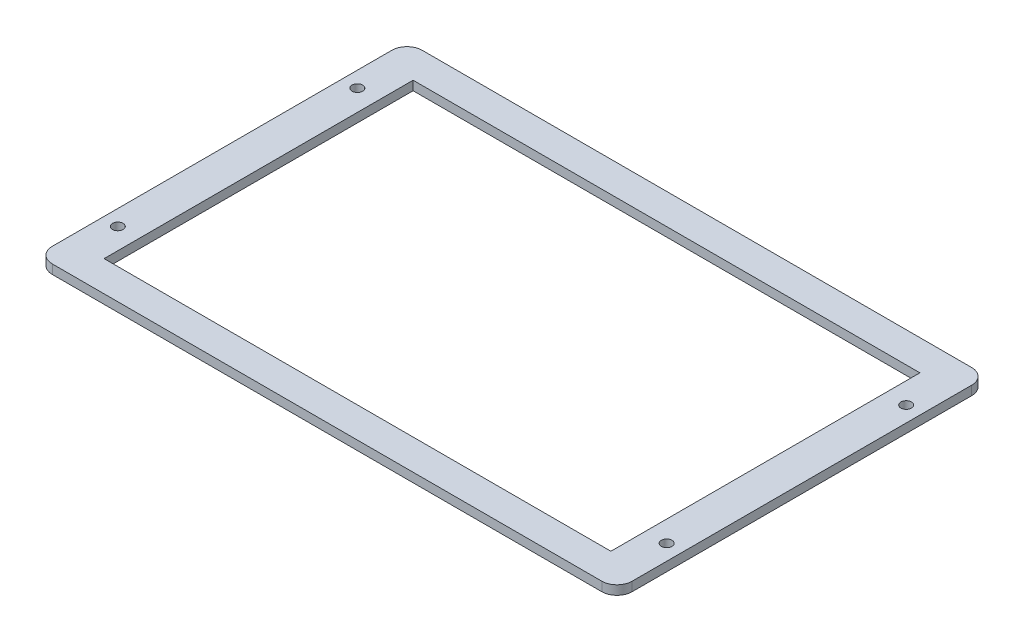
ISO-10303-21;
HEADER;
FILE_DESCRIPTION(('STEP AP214'),'2;1');
FILE_NAME('part.step','',(''),(''),'','','');
FILE_SCHEMA(('AUTOMOTIVE_DESIGN { 1 0 10303 214 1 1 1 1 }'));
ENDSEC;
DATA;
#1=APPLICATION_CONTEXT('core data for automotive mechanical design processes');
#2=APPLICATION_PROTOCOL_DEFINITION('international standard','automotive_design',2000,#1);
#3=PRODUCT_CONTEXT('',#1,'mechanical');
#4=PRODUCT('Part','Part','',(#3));
#5=PRODUCT_RELATED_PRODUCT_CATEGORY('part','',(#4));
#6=PRODUCT_DEFINITION_FORMATION('','',#4);
#7=PRODUCT_DEFINITION_CONTEXT('part definition',#1,'design');
#8=PRODUCT_DEFINITION('design','',#6,#7);
#9=PRODUCT_DEFINITION_SHAPE('','',#8);
#10=(LENGTH_UNIT() NAMED_UNIT(*) SI_UNIT(.MILLI.,.METRE.));
#11=(NAMED_UNIT(*) PLANE_ANGLE_UNIT() SI_UNIT($,.RADIAN.));
#12=(NAMED_UNIT(*) SI_UNIT($,.STERADIAN.) SOLID_ANGLE_UNIT());
#13=UNCERTAINTY_MEASURE_WITH_UNIT(LENGTH_MEASURE(1.E-05),#10,'distance_accuracy_value','');
#14=(GEOMETRIC_REPRESENTATION_CONTEXT(3) GLOBAL_UNCERTAINTY_ASSIGNED_CONTEXT((#13)) GLOBAL_UNIT_ASSIGNED_CONTEXT((#10,
#11,#12)) REPRESENTATION_CONTEXT('',''));
#15=CARTESIAN_POINT('',(0.,0.,0.));
#16=DIRECTION('',(0.,0.,1.));
#17=DIRECTION('',(1.,0.,0.));
#18=AXIS2_PLACEMENT_3D('',#15,#16,#17);
#19=CARTESIAN_POINT('',(0.,3.,0.));
#20=DIRECTION('',(0.,1.,0.));
#21=DIRECTION('',(0.,0.,1.));
#22=AXIS2_PLACEMENT_3D('',#19,#20,#21);
#23=PLANE('',#22);
#24=CARTESIAN_POINT('',(-90.05,3.,-39.2999999999998));
#25=DIRECTION('',(0.,1.,0.));
#26=DIRECTION('',(0.,0.,1.));
#27=AXIS2_PLACEMENT_3D('',#24,#25,#26);
#28=CIRCLE('',#27,1.75);
#29=CARTESIAN_POINT('',(-90.05,3.,-37.5499999999998));
#30=VERTEX_POINT('',#29);
#31=EDGE_CURVE('E457',#30,#30,#28,.T.);
#32=ORIENTED_EDGE('',*,*,#31,.F.);
#33=EDGE_LOOP('',(#32));
#34=FACE_BOUND('',#33,.T.);
#35=CARTESIAN_POINT('',(90.05,3.,39.3000000000002));
#36=DIRECTION('',(0.,1.,0.));
#37=DIRECTION('',(0.,0.,1.));
#38=AXIS2_PLACEMENT_3D('',#35,#36,#37);
#39=CIRCLE('',#38,1.75000000000001);
#40=CARTESIAN_POINT('',(90.05,3.,41.0500000000002));
#41=VERTEX_POINT('',#40);
#42=EDGE_CURVE('E452',#41,#41,#39,.T.);
#43=ORIENTED_EDGE('',*,*,#42,.F.);
#44=EDGE_LOOP('',(#43));
#45=FACE_BOUND('',#44,.T.);
#46=CARTESIAN_POINT('',(-90.05,3.,39.3));
#47=DIRECTION('',(0.,1.,0.));
#48=DIRECTION('',(0.,0.,1.));
#49=AXIS2_PLACEMENT_3D('',#46,#47,#48);
#50=CIRCLE('',#49,1.75000000000001);
#51=CARTESIAN_POINT('',(-90.05,3.,41.05));
#52=VERTEX_POINT('',#51);
#53=EDGE_CURVE('E447',#52,#52,#50,.T.);
#54=ORIENTED_EDGE('',*,*,#53,.F.);
#55=EDGE_LOOP('',(#54));
#56=FACE_BOUND('',#55,.T.);
#57=CARTESIAN_POINT('',(90.05,3.,-39.2999999999998));
#58=DIRECTION('',(0.,1.,0.));
#59=DIRECTION('',(0.,0.,1.));
#60=AXIS2_PLACEMENT_3D('',#57,#58,#59);
#61=CIRCLE('',#60,1.75000000000001);
#62=CARTESIAN_POINT('',(90.05,3.,-37.5499999999998));
#63=VERTEX_POINT('',#62);
#64=EDGE_CURVE('E443',#63,#63,#61,.T.);
#65=ORIENTED_EDGE('',*,*,#64,.F.);
#66=EDGE_LOOP('',(#65));
#67=FACE_BOUND('',#66,.T.);
#68=DIRECTION('',(0.,0.,1.));
#69=VECTOR('',#68,1.);
#70=CARTESIAN_POINT('',(-95.15,3.,60.7));
#71=LINE('',#70,#69);
#72=CARTESIAN_POINT('',(-95.15,3.,-55.7));
#73=VERTEX_POINT('',#72);
#74=CARTESIAN_POINT('',(-95.15,3.,55.7));
#75=VERTEX_POINT('',#74);
#76=EDGE_CURVE('E368',#73,#75,#71,.T.);
#77=ORIENTED_EDGE('',*,*,#76,.T.);
#78=CARTESIAN_POINT('',(-90.15,3.,55.7));
#79=DIRECTION('',(0.,1.,0.));
#80=DIRECTION('',(0.,0.,1.));
#81=AXIS2_PLACEMENT_3D('',#78,#79,#80);
#82=CIRCLE('',#81,5.);
#83=CARTESIAN_POINT('',(-90.15,3.,60.7));
#84=VERTEX_POINT('',#83);
#85=EDGE_CURVE('E334',#75,#84,#82,.T.);
#86=ORIENTED_EDGE('',*,*,#85,.T.);
#87=DIRECTION('',(1.,0.,0.));
#88=VECTOR('',#87,1.);
#89=CARTESIAN_POINT('',(95.15,3.,60.7));
#90=LINE('',#89,#88);
#91=CARTESIAN_POINT('',(90.15,3.,60.7));
#92=VERTEX_POINT('',#91);
#93=EDGE_CURVE('E372',#84,#92,#90,.T.);
#94=ORIENTED_EDGE('',*,*,#93,.T.);
#95=CARTESIAN_POINT('',(90.15,3.,55.7));
#96=DIRECTION('',(0.,1.,0.));
#97=DIRECTION('',(0.,0.,1.));
#98=AXIS2_PLACEMENT_3D('',#95,#96,#97);
#99=CIRCLE('',#98,5.);
#100=CARTESIAN_POINT('',(95.15,3.,55.7));
#101=VERTEX_POINT('',#100);
#102=EDGE_CURVE('E330',#92,#101,#99,.T.);
#103=ORIENTED_EDGE('',*,*,#102,.T.);
#104=DIRECTION('',(0.,0.,-1.));
#105=VECTOR('',#104,1.);
#106=CARTESIAN_POINT('',(95.15,3.,60.7));
#107=LINE('',#106,#105);
#108=CARTESIAN_POINT('',(95.15,3.,-55.7));
#109=VERTEX_POINT('',#108);
#110=EDGE_CURVE('E352',#101,#109,#107,.T.);
#111=ORIENTED_EDGE('',*,*,#110,.T.);
#112=CARTESIAN_POINT('',(90.15,3.,-55.7));
#113=DIRECTION('',(0.,1.,0.));
#114=DIRECTION('',(0.,0.,1.));
#115=AXIS2_PLACEMENT_3D('',#112,#113,#114);
#116=CIRCLE('',#115,5.);
#117=CARTESIAN_POINT('',(90.15,3.,-60.7));
#118=VERTEX_POINT('',#117);
#119=EDGE_CURVE('E75',#109,#118,#116,.T.);
#120=ORIENTED_EDGE('',*,*,#119,.T.);
#121=DIRECTION('',(-1.,0.,0.));
#122=VECTOR('',#121,1.);
#123=CARTESIAN_POINT('',(95.15,3.,-60.7));
#124=LINE('',#123,#122);
#125=CARTESIAN_POINT('',(-90.15,3.,-60.7));
#126=VERTEX_POINT('',#125);
#127=EDGE_CURVE('E348',#118,#126,#124,.T.);
#128=ORIENTED_EDGE('',*,*,#127,.T.);
#129=CARTESIAN_POINT('',(-90.15,3.,-55.7));
#130=DIRECTION('',(0.,1.,0.));
#131=DIRECTION('',(0.,0.,1.));
#132=AXIS2_PLACEMENT_3D('',#129,#130,#131);
#133=CIRCLE('',#132,5.);
#134=EDGE_CURVE('E329',#126,#73,#133,.T.);
#135=ORIENTED_EDGE('',*,*,#134,.T.);
#136=EDGE_LOOP('',(#77,#86,#94,#103,#111,#120,#128,#135));
#137=FACE_BOUND('',#136,.T.);
#138=DIRECTION('',(1.,0.,0.));
#139=VECTOR('',#138,1.);
#140=CARTESIAN_POINT('',(83.15,3.,50.7));
#141=LINE('',#140,#139);
#142=CARTESIAN_POINT('',(-83.15,3.,50.7));
#143=VERTEX_POINT('',#142);
#144=CARTESIAN_POINT('',(83.15,3.,50.7));
#145=VERTEX_POINT('',#144);
#146=EDGE_CURVE('E175',#143,#145,#141,.T.);
#147=ORIENTED_EDGE('',*,*,#146,.F.);
#148=DIRECTION('',(0.,0.,1.));
#149=VECTOR('',#148,1.);
#150=CARTESIAN_POINT('',(-83.15,3.,-50.7));
#151=LINE('',#150,#149);
#152=CARTESIAN_POINT('',(-83.15,3.,-50.7));
#153=VERTEX_POINT('',#152);
#154=EDGE_CURVE('E164',#153,#143,#151,.T.);
#155=ORIENTED_EDGE('',*,*,#154,.F.);
#156=DIRECTION('',(-1.,0.,0.));
#157=VECTOR('',#156,1.);
#158=CARTESIAN_POINT('',(83.15,3.,-50.7));
#159=LINE('',#158,#157);
#160=CARTESIAN_POINT('',(83.15,3.,-50.7));
#161=VERTEX_POINT('',#160);
#162=EDGE_CURVE('E194',#161,#153,#159,.T.);
#163=ORIENTED_EDGE('',*,*,#162,.F.);
#164=DIRECTION('',(0.,0.,-1.));
#165=VECTOR('',#164,1.);
#166=CARTESIAN_POINT('',(83.15,3.,-50.7));
#167=LINE('',#166,#165);
#168=EDGE_CURVE('E189',#145,#161,#167,.T.);
#169=ORIENTED_EDGE('',*,*,#168,.F.);
#170=EDGE_LOOP('',(#147,#155,#163,#169));
#171=FACE_BOUND('',#170,.T.);
#172=ADVANCED_FACE('F48',(#34,#45,#56,#67,#137,#171),#23,.T.);
#173=CARTESIAN_POINT('',(0.,0.,0.));
#174=DIRECTION('',(0.,1.,0.));
#175=DIRECTION('',(0.,0.,1.));
#176=AXIS2_PLACEMENT_3D('',#173,#174,#175);
#177=PLANE('',#176);
#178=CARTESIAN_POINT('',(-90.05,0.,-39.2999999999998));
#179=DIRECTION('',(0.,1.,0.));
#180=DIRECTION('',(0.,0.,1.));
#181=AXIS2_PLACEMENT_3D('',#178,#179,#180);
#182=CIRCLE('',#181,1.75);
#183=CARTESIAN_POINT('',(-90.05,0.,-37.5499999999998));
#184=VERTEX_POINT('',#183);
#185=EDGE_CURVE('E446',#184,#184,#182,.T.);
#186=ORIENTED_EDGE('',*,*,#185,.T.);
#187=EDGE_LOOP('',(#186));
#188=FACE_BOUND('',#187,.T.);
#189=CARTESIAN_POINT('',(90.05,0.,39.3000000000002));
#190=DIRECTION('',(0.,1.,0.));
#191=DIRECTION('',(0.,0.,1.));
#192=AXIS2_PLACEMENT_3D('',#189,#190,#191);
#193=CIRCLE('',#192,1.75000000000001);
#194=CARTESIAN_POINT('',(90.05,0.,41.0500000000002));
#195=VERTEX_POINT('',#194);
#196=EDGE_CURVE('E455',#195,#195,#193,.T.);
#197=ORIENTED_EDGE('',*,*,#196,.T.);
#198=EDGE_LOOP('',(#197));
#199=FACE_BOUND('',#198,.T.);
#200=CARTESIAN_POINT('',(-90.05,0.,39.3));
#201=DIRECTION('',(0.,1.,0.));
#202=DIRECTION('',(0.,0.,1.));
#203=AXIS2_PLACEMENT_3D('',#200,#201,#202);
#204=CIRCLE('',#203,1.75000000000001);
#205=CARTESIAN_POINT('',(-90.05,0.,41.05));
#206=VERTEX_POINT('',#205);
#207=EDGE_CURVE('E450',#206,#206,#204,.T.);
#208=ORIENTED_EDGE('',*,*,#207,.T.);
#209=EDGE_LOOP('',(#208));
#210=FACE_BOUND('',#209,.T.);
#211=CARTESIAN_POINT('',(90.05,0.,-39.2999999999998));
#212=DIRECTION('',(0.,1.,0.));
#213=DIRECTION('',(0.,0.,1.));
#214=AXIS2_PLACEMENT_3D('',#211,#212,#213);
#215=CIRCLE('',#214,1.75000000000001);
#216=CARTESIAN_POINT('',(90.05,0.,-37.5499999999998));
#217=VERTEX_POINT('',#216);
#218=EDGE_CURVE('E216',#217,#217,#215,.T.);
#219=ORIENTED_EDGE('',*,*,#218,.T.);
#220=EDGE_LOOP('',(#219));
#221=FACE_BOUND('',#220,.T.);
#222=DIRECTION('',(1.,0.,0.));
#223=VECTOR('',#222,1.);
#224=CARTESIAN_POINT('',(95.15,0.,60.7));
#225=LINE('',#224,#223);
#226=CARTESIAN_POINT('',(-90.15,0.,60.7));
#227=VERTEX_POINT('',#226);
#228=CARTESIAN_POINT('',(90.15,0.,60.7));
#229=VERTEX_POINT('',#228);
#230=EDGE_CURVE('E359',#227,#229,#225,.T.);
#231=ORIENTED_EDGE('',*,*,#230,.F.);
#232=CARTESIAN_POINT('',(-90.15,0.,55.7));
#233=DIRECTION('',(0.,1.,0.));
#234=DIRECTION('',(0.,0.,1.));
#235=AXIS2_PLACEMENT_3D('',#232,#233,#234);
#236=CIRCLE('',#235,5.);
#237=CARTESIAN_POINT('',(-95.15,0.,55.7));
#238=VERTEX_POINT('',#237);
#239=EDGE_CURVE('E425',#227,#238,#236,.F.);
#240=ORIENTED_EDGE('',*,*,#239,.T.);
#241=DIRECTION('',(0.,0.,1.));
#242=VECTOR('',#241,1.);
#243=CARTESIAN_POINT('',(-95.15,0.,60.7));
#244=LINE('',#243,#242);
#245=CARTESIAN_POINT('',(-95.15,0.,-55.7));
#246=VERTEX_POINT('',#245);
#247=EDGE_CURVE('E184',#246,#238,#244,.T.);
#248=ORIENTED_EDGE('',*,*,#247,.F.);
#249=CARTESIAN_POINT('',(-90.15,0.,-55.7));
#250=DIRECTION('',(0.,1.,0.));
#251=DIRECTION('',(0.,0.,1.));
#252=AXIS2_PLACEMENT_3D('',#249,#250,#251);
#253=CIRCLE('',#252,5.);
#254=CARTESIAN_POINT('',(-90.15,0.,-60.7));
#255=VERTEX_POINT('',#254);
#256=EDGE_CURVE('E423',#246,#255,#253,.F.);
#257=ORIENTED_EDGE('',*,*,#256,.T.);
#258=DIRECTION('',(-1.,0.,0.));
#259=VECTOR('',#258,1.);
#260=CARTESIAN_POINT('',(95.15,0.,-60.7));
#261=LINE('',#260,#259);
#262=CARTESIAN_POINT('',(90.15,0.,-60.7));
#263=VERTEX_POINT('',#262);
#264=EDGE_CURVE('E373',#263,#255,#261,.T.);
#265=ORIENTED_EDGE('',*,*,#264,.F.);
#266=CARTESIAN_POINT('',(90.15,0.,-55.7));
#267=DIRECTION('',(0.,1.,0.));
#268=DIRECTION('',(0.,0.,1.));
#269=AXIS2_PLACEMENT_3D('',#266,#267,#268);
#270=CIRCLE('',#269,5.);
#271=CARTESIAN_POINT('',(95.15,0.,-55.7));
#272=VERTEX_POINT('',#271);
#273=EDGE_CURVE('E404',#263,#272,#270,.F.);
#274=ORIENTED_EDGE('',*,*,#273,.T.);
#275=DIRECTION('',(0.,0.,-1.));
#276=VECTOR('',#275,1.);
#277=CARTESIAN_POINT('',(95.15,0.,60.7));
#278=LINE('',#277,#276);
#279=CARTESIAN_POINT('',(95.15,0.,55.7));
#280=VERTEX_POINT('',#279);
#281=EDGE_CURVE('E397',#280,#272,#278,.T.);
#282=ORIENTED_EDGE('',*,*,#281,.F.);
#283=CARTESIAN_POINT('',(90.15,0.,55.7));
#284=DIRECTION('',(0.,1.,0.));
#285=DIRECTION('',(0.,0.,1.));
#286=AXIS2_PLACEMENT_3D('',#283,#284,#285);
#287=CIRCLE('',#286,5.);
#288=EDGE_CURVE('E401',#280,#229,#287,.F.);
#289=ORIENTED_EDGE('',*,*,#288,.T.);
#290=EDGE_LOOP('',(#231,#240,#248,#257,#265,#274,#282,#289));
#291=FACE_BOUND('',#290,.T.);
#292=DIRECTION('',(0.,0.,1.));
#293=VECTOR('',#292,1.);
#294=CARTESIAN_POINT('',(-83.15,0.,-50.7));
#295=LINE('',#294,#293);
#296=CARTESIAN_POINT('',(-83.15,0.,-50.7));
#297=VERTEX_POINT('',#296);
#298=CARTESIAN_POINT('',(-83.15,0.,50.7));
#299=VERTEX_POINT('',#298);
#300=EDGE_CURVE('E212',#297,#299,#295,.T.);
#301=ORIENTED_EDGE('',*,*,#300,.T.);
#302=DIRECTION('',(1.,0.,0.));
#303=VECTOR('',#302,1.);
#304=CARTESIAN_POINT('',(83.15,0.,50.7));
#305=LINE('',#304,#303);
#306=CARTESIAN_POINT('',(83.15,0.,50.7));
#307=VERTEX_POINT('',#306);
#308=EDGE_CURVE('E182',#299,#307,#305,.T.);
#309=ORIENTED_EDGE('',*,*,#308,.T.);
#310=DIRECTION('',(0.,0.,-1.));
#311=VECTOR('',#310,1.);
#312=CARTESIAN_POINT('',(83.15,0.,-50.7));
#313=LINE('',#312,#311);
#314=CARTESIAN_POINT('',(83.15,0.,-50.7));
#315=VERTEX_POINT('',#314);
#316=EDGE_CURVE('E242',#307,#315,#313,.T.);
#317=ORIENTED_EDGE('',*,*,#316,.T.);
#318=DIRECTION('',(-1.,0.,0.));
#319=VECTOR('',#318,1.);
#320=CARTESIAN_POINT('',(83.15,0.,-50.7));
#321=LINE('',#320,#319);
#322=EDGE_CURVE('E176',#315,#297,#321,.T.);
#323=ORIENTED_EDGE('',*,*,#322,.T.);
#324=EDGE_LOOP('',(#301,#309,#317,#323));
#325=FACE_BOUND('',#324,.T.);
#326=ADVANCED_FACE('F252',(#188,#199,#210,#221,#291,#325),#177,.F.);
#327=CARTESIAN_POINT('',(-95.15,3.,60.7));
#328=DIRECTION('',(1.,0.,0.));
#329=DIRECTION('',(0.,0.,-1.));
#330=AXIS2_PLACEMENT_3D('',#327,#328,#329);
#331=PLANE('',#330);
#332=ORIENTED_EDGE('',*,*,#247,.T.);
#333=DIRECTION('',(0.,-1.,0.));
#334=VECTOR('',#333,1.);
#335=CARTESIAN_POINT('',(-95.15,3.,55.7));
#336=LINE('',#335,#334);
#337=EDGE_CURVE('E336',#238,#75,#336,.F.);
#338=ORIENTED_EDGE('',*,*,#337,.T.);
#339=ORIENTED_EDGE('',*,*,#76,.F.);
#340=DIRECTION('',(0.,-1.,0.));
#341=VECTOR('',#340,1.);
#342=CARTESIAN_POINT('',(-95.15,3.,-55.7));
#343=LINE('',#342,#341);
#344=EDGE_CURVE('E427',#73,#246,#343,.T.);
#345=ORIENTED_EDGE('',*,*,#344,.T.);
#346=EDGE_LOOP('',(#332,#338,#339,#345));
#347=FACE_BOUND('',#346,.T.);
#348=ADVANCED_FACE('F275',(#347),#331,.F.);
#349=CARTESIAN_POINT('',(95.15,3.,60.7));
#350=DIRECTION('',(0.,0.,-1.));
#351=DIRECTION('',(-1.,0.,0.));
#352=AXIS2_PLACEMENT_3D('',#349,#350,#351);
#353=PLANE('',#352);
#354=ORIENTED_EDGE('',*,*,#93,.F.);
#355=DIRECTION('',(0.,-1.,0.));
#356=VECTOR('',#355,1.);
#357=CARTESIAN_POINT('',(-90.15,3.,60.7));
#358=LINE('',#357,#356);
#359=EDGE_CURVE('E415',#84,#227,#358,.T.);
#360=ORIENTED_EDGE('',*,*,#359,.T.);
#361=ORIENTED_EDGE('',*,*,#230,.T.);
#362=DIRECTION('',(0.,-1.,0.));
#363=VECTOR('',#362,1.);
#364=CARTESIAN_POINT('',(90.15,3.,60.7));
#365=LINE('',#364,#363);
#366=EDGE_CURVE('E351',#229,#92,#365,.F.);
#367=ORIENTED_EDGE('',*,*,#366,.T.);
#368=EDGE_LOOP('',(#354,#360,#361,#367));
#369=FACE_BOUND('',#368,.T.);
#370=ADVANCED_FACE('F297',(#369),#353,.F.);
#371=CARTESIAN_POINT('',(95.15,3.,60.7));
#372=DIRECTION('',(-1.,0.,0.));
#373=DIRECTION('',(0.,0.,1.));
#374=AXIS2_PLACEMENT_3D('',#371,#372,#373);
#375=PLANE('',#374);
#376=ORIENTED_EDGE('',*,*,#281,.T.);
#377=DIRECTION('',(0.,-1.,0.));
#378=VECTOR('',#377,1.);
#379=CARTESIAN_POINT('',(95.15,3.,-55.7));
#380=LINE('',#379,#378);
#381=EDGE_CURVE('E12',#272,#109,#380,.F.);
#382=ORIENTED_EDGE('',*,*,#381,.T.);
#383=ORIENTED_EDGE('',*,*,#110,.F.);
#384=DIRECTION('',(0.,-1.,0.));
#385=VECTOR('',#384,1.);
#386=CARTESIAN_POINT('',(95.15,3.,55.7));
#387=LINE('',#386,#385);
#388=EDGE_CURVE('E57',#101,#280,#387,.T.);
#389=ORIENTED_EDGE('',*,*,#388,.T.);
#390=EDGE_LOOP('',(#376,#382,#383,#389));
#391=FACE_BOUND('',#390,.T.);
#392=ADVANCED_FACE('F292',(#391),#375,.F.);
#393=CARTESIAN_POINT('',(95.15,3.,-60.7));
#394=DIRECTION('',(0.,0.,1.));
#395=DIRECTION('',(1.,0.,0.));
#396=AXIS2_PLACEMENT_3D('',#393,#394,#395);
#397=PLANE('',#396);
#398=ORIENTED_EDGE('',*,*,#264,.T.);
#399=DIRECTION('',(0.,-1.,0.));
#400=VECTOR('',#399,1.);
#401=CARTESIAN_POINT('',(-90.15,3.,-60.7));
#402=LINE('',#401,#400);
#403=EDGE_CURVE('E67',#255,#126,#402,.F.);
#404=ORIENTED_EDGE('',*,*,#403,.T.);
#405=ORIENTED_EDGE('',*,*,#127,.F.);
#406=DIRECTION('',(0.,-1.,0.));
#407=VECTOR('',#406,1.);
#408=CARTESIAN_POINT('',(90.15,3.,-60.7));
#409=LINE('',#408,#407);
#410=EDGE_CURVE('E327',#118,#263,#409,.T.);
#411=ORIENTED_EDGE('',*,*,#410,.T.);
#412=EDGE_LOOP('',(#398,#404,#405,#411));
#413=FACE_BOUND('',#412,.T.);
#414=ADVANCED_FACE('F289',(#413),#397,.F.);
#415=CARTESIAN_POINT('',(-83.15,3.,-50.7));
#416=DIRECTION('',(1.,0.,0.));
#417=DIRECTION('',(0.,0.,-1.));
#418=AXIS2_PLACEMENT_3D('',#415,#416,#417);
#419=PLANE('',#418);
#420=ORIENTED_EDGE('',*,*,#300,.F.);
#421=DIRECTION('',(0.,-1.,0.));
#422=VECTOR('',#421,1.);
#423=CARTESIAN_POINT('',(-83.15,3.,-50.7));
#424=LINE('',#423,#422);
#425=EDGE_CURVE('E170',#153,#297,#424,.T.);
#426=ORIENTED_EDGE('',*,*,#425,.F.);
#427=ORIENTED_EDGE('',*,*,#154,.T.);
#428=DIRECTION('',(0.,-1.,0.));
#429=VECTOR('',#428,1.);
#430=CARTESIAN_POINT('',(-83.15,3.,50.7));
#431=LINE('',#430,#429);
#432=EDGE_CURVE('E167',#143,#299,#431,.T.);
#433=ORIENTED_EDGE('',*,*,#432,.T.);
#434=EDGE_LOOP('',(#420,#426,#427,#433));
#435=FACE_BOUND('',#434,.T.);
#436=ADVANCED_FACE('F166',(#435),#419,.T.);
#437=CARTESIAN_POINT('',(83.15,3.,50.7));
#438=DIRECTION('',(0.,0.,-1.));
#439=DIRECTION('',(-1.,0.,0.));
#440=AXIS2_PLACEMENT_3D('',#437,#438,#439);
#441=PLANE('',#440);
#442=ORIENTED_EDGE('',*,*,#308,.F.);
#443=ORIENTED_EDGE('',*,*,#432,.F.);
#444=ORIENTED_EDGE('',*,*,#146,.T.);
#445=DIRECTION('',(0.,-1.,0.));
#446=VECTOR('',#445,1.);
#447=CARTESIAN_POINT('',(83.15,3.,50.7));
#448=LINE('',#447,#446);
#449=EDGE_CURVE('E185',#145,#307,#448,.T.);
#450=ORIENTED_EDGE('',*,*,#449,.T.);
#451=EDGE_LOOP('',(#442,#443,#444,#450));
#452=FACE_BOUND('',#451,.T.);
#453=ADVANCED_FACE('F179',(#452),#441,.T.);
#454=CARTESIAN_POINT('',(83.15,3.,-50.7));
#455=DIRECTION('',(-1.,0.,0.));
#456=DIRECTION('',(0.,0.,1.));
#457=AXIS2_PLACEMENT_3D('',#454,#455,#456);
#458=PLANE('',#457);
#459=ORIENTED_EDGE('',*,*,#316,.F.);
#460=ORIENTED_EDGE('',*,*,#449,.F.);
#461=ORIENTED_EDGE('',*,*,#168,.T.);
#462=DIRECTION('',(0.,-1.,0.));
#463=VECTOR('',#462,1.);
#464=CARTESIAN_POINT('',(83.15,3.,-50.7));
#465=LINE('',#464,#463);
#466=EDGE_CURVE('E231',#161,#315,#465,.T.);
#467=ORIENTED_EDGE('',*,*,#466,.T.);
#468=EDGE_LOOP('',(#459,#460,#461,#467));
#469=FACE_BOUND('',#468,.T.);
#470=ADVANCED_FACE('F257',(#469),#458,.T.);
#471=CARTESIAN_POINT('',(83.15,3.,-50.7));
#472=DIRECTION('',(0.,0.,1.));
#473=DIRECTION('',(1.,0.,0.));
#474=AXIS2_PLACEMENT_3D('',#471,#472,#473);
#475=PLANE('',#474);
#476=ORIENTED_EDGE('',*,*,#322,.F.);
#477=ORIENTED_EDGE('',*,*,#466,.F.);
#478=ORIENTED_EDGE('',*,*,#162,.T.);
#479=ORIENTED_EDGE('',*,*,#425,.T.);
#480=EDGE_LOOP('',(#476,#477,#478,#479));
#481=FACE_BOUND('',#480,.T.);
#482=ADVANCED_FACE('F255',(#481),#475,.T.);
#483=CARTESIAN_POINT('',(-90.15,3.,55.7));
#484=DIRECTION('',(0.,-1.,0.));
#485=DIRECTION('',(0.,0.,-1.));
#486=AXIS2_PLACEMENT_3D('',#483,#484,#485);
#487=CYLINDRICAL_SURFACE('',#486,5.);
#488=ORIENTED_EDGE('',*,*,#85,.F.);
#489=ORIENTED_EDGE('',*,*,#337,.F.);
#490=ORIENTED_EDGE('',*,*,#239,.F.);
#491=ORIENTED_EDGE('',*,*,#359,.F.);
#492=EDGE_LOOP('',(#488,#489,#490,#491));
#493=FACE_BOUND('',#492,.T.);
#494=ADVANCED_FACE('F265',(#493),#487,.T.);
#495=CARTESIAN_POINT('',(-90.15,3.,-55.7));
#496=DIRECTION('',(0.,-1.,0.));
#497=DIRECTION('',(0.,0.,-1.));
#498=AXIS2_PLACEMENT_3D('',#495,#496,#497);
#499=CYLINDRICAL_SURFACE('',#498,5.);
#500=ORIENTED_EDGE('',*,*,#134,.F.);
#501=ORIENTED_EDGE('',*,*,#403,.F.);
#502=ORIENTED_EDGE('',*,*,#256,.F.);
#503=ORIENTED_EDGE('',*,*,#344,.F.);
#504=EDGE_LOOP('',(#500,#501,#502,#503));
#505=FACE_BOUND('',#504,.T.);
#506=ADVANCED_FACE('F310',(#505),#499,.T.);
#507=CARTESIAN_POINT('',(90.15,3.,-55.7));
#508=DIRECTION('',(0.,-1.,0.));
#509=DIRECTION('',(0.,0.,-1.));
#510=AXIS2_PLACEMENT_3D('',#507,#508,#509);
#511=CYLINDRICAL_SURFACE('',#510,5.);
#512=ORIENTED_EDGE('',*,*,#119,.F.);
#513=ORIENTED_EDGE('',*,*,#381,.F.);
#514=ORIENTED_EDGE('',*,*,#273,.F.);
#515=ORIENTED_EDGE('',*,*,#410,.F.);
#516=EDGE_LOOP('',(#512,#513,#514,#515));
#517=FACE_BOUND('',#516,.T.);
#518=ADVANCED_FACE('F315',(#517),#511,.T.);
#519=CARTESIAN_POINT('',(90.15,3.,55.7));
#520=DIRECTION('',(0.,-1.,0.));
#521=DIRECTION('',(0.,0.,-1.));
#522=AXIS2_PLACEMENT_3D('',#519,#520,#521);
#523=CYLINDRICAL_SURFACE('',#522,5.);
#524=ORIENTED_EDGE('',*,*,#102,.F.);
#525=ORIENTED_EDGE('',*,*,#366,.F.);
#526=ORIENTED_EDGE('',*,*,#288,.F.);
#527=ORIENTED_EDGE('',*,*,#388,.F.);
#528=EDGE_LOOP('',(#524,#525,#526,#527));
#529=FACE_BOUND('',#528,.T.);
#530=ADVANCED_FACE('F51',(#529),#523,.T.);
#531=CARTESIAN_POINT('',(90.05,0.,-39.2999999999998));
#532=DIRECTION('',(0.,1.,0.));
#533=DIRECTION('',(0.,0.,1.));
#534=AXIS2_PLACEMENT_3D('',#531,#532,#533);
#535=CYLINDRICAL_SURFACE('',#534,1.75000000000001);
#536=ORIENTED_EDGE('',*,*,#218,.F.);
#537=EDGE_LOOP('',(#536));
#538=FACE_BOUND('',#537,.T.);
#539=ORIENTED_EDGE('',*,*,#64,.T.);
#540=EDGE_LOOP('',(#539));
#541=FACE_BOUND('',#540,.T.);
#542=ADVANCED_FACE('F322',(#538,#541),#535,.F.);
#543=CARTESIAN_POINT('',(-90.05,0.,39.3));
#544=DIRECTION('',(0.,1.,0.));
#545=DIRECTION('',(0.,0.,1.));
#546=AXIS2_PLACEMENT_3D('',#543,#544,#545);
#547=CYLINDRICAL_SURFACE('',#546,1.75000000000001);
#548=ORIENTED_EDGE('',*,*,#207,.F.);
#549=EDGE_LOOP('',(#548));
#550=FACE_BOUND('',#549,.T.);
#551=ORIENTED_EDGE('',*,*,#53,.T.);
#552=EDGE_LOOP('',(#551));
#553=FACE_BOUND('',#552,.T.);
#554=ADVANCED_FACE('F487',(#550,#553),#547,.F.);
#555=CARTESIAN_POINT('',(90.05,0.,39.3000000000002));
#556=DIRECTION('',(0.,1.,0.));
#557=DIRECTION('',(0.,0.,1.));
#558=AXIS2_PLACEMENT_3D('',#555,#556,#557);
#559=CYLINDRICAL_SURFACE('',#558,1.75000000000001);
#560=ORIENTED_EDGE('',*,*,#196,.F.);
#561=EDGE_LOOP('',(#560));
#562=FACE_BOUND('',#561,.T.);
#563=ORIENTED_EDGE('',*,*,#42,.T.);
#564=EDGE_LOOP('',(#563));
#565=FACE_BOUND('',#564,.T.);
#566=ADVANCED_FACE('F490',(#562,#565),#559,.F.);
#567=CARTESIAN_POINT('',(-90.05,0.,-39.2999999999998));
#568=DIRECTION('',(0.,1.,0.));
#569=DIRECTION('',(0.,0.,1.));
#570=AXIS2_PLACEMENT_3D('',#567,#568,#569);
#571=CYLINDRICAL_SURFACE('',#570,1.75);
#572=ORIENTED_EDGE('',*,*,#185,.F.);
#573=EDGE_LOOP('',(#572));
#574=FACE_BOUND('',#573,.T.);
#575=ORIENTED_EDGE('',*,*,#31,.T.);
#576=EDGE_LOOP('',(#575));
#577=FACE_BOUND('',#576,.T.);
#578=ADVANCED_FACE('F507',(#574,#577),#571,.F.);
#579=CLOSED_SHELL('',(#172,#326,#348,#370,#392,#414,#436,#453,#470,#482,#494,#506,#518,#530,
#542,#554,#566,#578));
#580=MANIFOLD_SOLID_BREP('B2',#579);
#581=ADVANCED_BREP_SHAPE_REPRESENTATION('',(#18,#580),#14);
#582=SHAPE_DEFINITION_REPRESENTATION(#9,#581);
ENDSEC;
END-ISO-10303-21;
